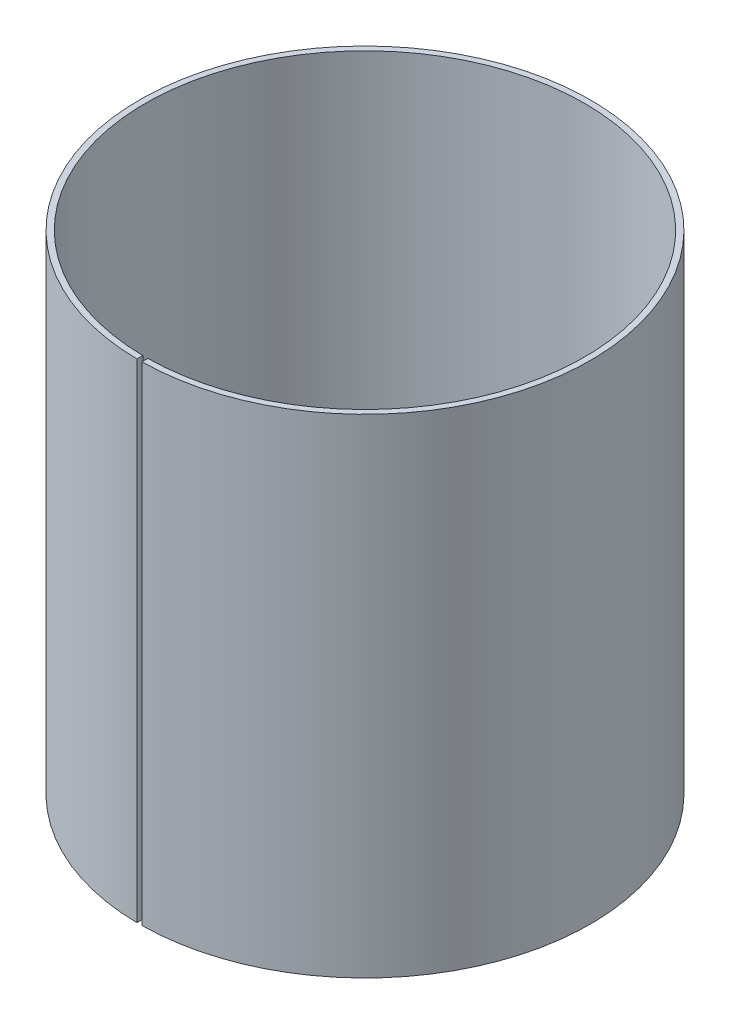
ISO-10303-21;
HEADER;
FILE_DESCRIPTION(('STEP AP214'),'2;1');
FILE_NAME('part.step','',(''),(''),'','','');
FILE_SCHEMA(('AUTOMOTIVE_DESIGN { 1 0 10303 214 1 1 1 1 }'));
ENDSEC;
DATA;
#1=APPLICATION_CONTEXT('core data for automotive mechanical design processes');
#2=APPLICATION_PROTOCOL_DEFINITION('international standard','automotive_design',2000,#1);
#3=PRODUCT_CONTEXT('',#1,'mechanical');
#4=PRODUCT('Part','Part','',(#3));
#5=PRODUCT_RELATED_PRODUCT_CATEGORY('part','',(#4));
#6=PRODUCT_DEFINITION_FORMATION('','',#4);
#7=PRODUCT_DEFINITION_CONTEXT('part definition',#1,'design');
#8=PRODUCT_DEFINITION('design','',#6,#7);
#9=PRODUCT_DEFINITION_SHAPE('','',#8);
#10=(LENGTH_UNIT() NAMED_UNIT(*) SI_UNIT(.MILLI.,.METRE.));
#11=(NAMED_UNIT(*) PLANE_ANGLE_UNIT() SI_UNIT($,.RADIAN.));
#12=(NAMED_UNIT(*) SI_UNIT($,.STERADIAN.) SOLID_ANGLE_UNIT());
#13=UNCERTAINTY_MEASURE_WITH_UNIT(LENGTH_MEASURE(1.E-05),#10,'distance_accuracy_value','');
#14=(GEOMETRIC_REPRESENTATION_CONTEXT(3) GLOBAL_UNCERTAINTY_ASSIGNED_CONTEXT((#13)) GLOBAL_UNIT_ASSIGNED_CONTEXT((#10,
#11,#12)) REPRESENTATION_CONTEXT('',''));
#15=CARTESIAN_POINT('',(0.,0.,0.));
#16=DIRECTION('',(0.,0.,1.));
#17=DIRECTION('',(1.,0.,0.));
#18=AXIS2_PLACEMENT_3D('',#15,#16,#17);
#19=CARTESIAN_POINT('',(0.,100.,0.));
#20=DIRECTION('',(0.,1.,0.));
#21=DIRECTION('',(0.,0.,1.));
#22=AXIS2_PLACEMENT_3D('',#19,#20,#21);
#23=PLANE('',#22);
#24=CARTESIAN_POINT('',(0.,100.,0.));
#25=DIRECTION('',(0.,1.,0.));
#26=DIRECTION('',(0.,0.,1.));
#27=AXIS2_PLACEMENT_3D('',#24,#25,#26);
#28=CIRCLE('',#27,45.);
#29=CARTESIAN_POINT('',(0.500000000000012,100.,44.9972221364831));
#30=VERTEX_POINT('',#29);
#31=CARTESIAN_POINT('',(-0.5,100.,44.9972221364831));
#32=VERTEX_POINT('',#31);
#33=EDGE_CURVE('E107',#30,#32,#28,.T.);
#34=ORIENTED_EDGE('',*,*,#33,.F.);
#35=DIRECTION('',(0.,0.,-1.));
#36=VECTOR('',#35,1.);
#37=CARTESIAN_POINT('',(0.500000000000012,100.,93.));
#38=LINE('',#37,#36);
#39=CARTESIAN_POINT('',(0.500000000000012,100.,46.1972942930644));
#40=VERTEX_POINT('',#39);
#41=EDGE_CURVE('E67',#40,#30,#38,.T.);
#42=ORIENTED_EDGE('',*,*,#41,.F.);
#43=CARTESIAN_POINT('',(0.,100.,0.));
#44=DIRECTION('',(0.,1.,0.));
#45=DIRECTION('',(0.,0.,1.));
#46=AXIS2_PLACEMENT_3D('',#43,#44,#45);
#47=CIRCLE('',#46,46.2);
#48=CARTESIAN_POINT('',(-0.5,100.,46.1972942930644));
#49=VERTEX_POINT('',#48);
#50=EDGE_CURVE('E106',#40,#49,#47,.T.);
#51=ORIENTED_EDGE('',*,*,#50,.T.);
#52=DIRECTION('',(0.,0.,-1.));
#53=VECTOR('',#52,1.);
#54=CARTESIAN_POINT('',(-0.5,100.,93.));
#55=LINE('',#54,#53);
#56=EDGE_CURVE('E85',#49,#32,#55,.T.);
#57=ORIENTED_EDGE('',*,*,#56,.T.);
#58=EDGE_LOOP('',(#34,#42,#51,#57));
#59=FACE_BOUND('',#58,.T.);
#60=ADVANCED_FACE('F43',(#59),#23,.T.);
#61=CARTESIAN_POINT('',(0.,0.,0.));
#62=DIRECTION('',(0.,1.,0.));
#63=DIRECTION('',(0.,0.,1.));
#64=AXIS2_PLACEMENT_3D('',#61,#62,#63);
#65=PLANE('',#64);
#66=DIRECTION('',(0.,0.,-1.));
#67=VECTOR('',#66,1.);
#68=CARTESIAN_POINT('',(0.500000000000014,0.,93.));
#69=LINE('',#68,#67);
#70=CARTESIAN_POINT('',(0.500000000000014,0.,46.1972942930644));
#71=VERTEX_POINT('',#70);
#72=CARTESIAN_POINT('',(0.500000000000014,0.,44.9972221364831));
#73=VERTEX_POINT('',#72);
#74=EDGE_CURVE('E92',#71,#73,#69,.T.);
#75=ORIENTED_EDGE('',*,*,#74,.T.);
#76=CARTESIAN_POINT('',(0.,0.,0.));
#77=DIRECTION('',(0.,1.,0.));
#78=DIRECTION('',(0.,0.,1.));
#79=AXIS2_PLACEMENT_3D('',#76,#77,#78);
#80=CIRCLE('',#79,45.);
#81=CARTESIAN_POINT('',(-0.500000000000001,0.,44.9972221364831));
#82=VERTEX_POINT('',#81);
#83=EDGE_CURVE('E101',#73,#82,#80,.T.);
#84=ORIENTED_EDGE('',*,*,#83,.T.);
#85=DIRECTION('',(0.,0.,-1.));
#86=VECTOR('',#85,1.);
#87=CARTESIAN_POINT('',(-0.499999999999988,0.,93.));
#88=LINE('',#87,#86);
#89=CARTESIAN_POINT('',(-0.499999999999988,0.,46.1972942930644));
#90=VERTEX_POINT('',#89);
#91=EDGE_CURVE('E59',#90,#82,#88,.T.);
#92=ORIENTED_EDGE('',*,*,#91,.F.);
#93=CARTESIAN_POINT('',(0.,0.,0.));
#94=DIRECTION('',(0.,1.,0.));
#95=DIRECTION('',(0.,0.,1.));
#96=AXIS2_PLACEMENT_3D('',#93,#94,#95);
#97=CIRCLE('',#96,46.2);
#98=EDGE_CURVE('E99',#71,#90,#97,.T.);
#99=ORIENTED_EDGE('',*,*,#98,.F.);
#100=EDGE_LOOP('',(#75,#84,#92,#99));
#101=FACE_BOUND('',#100,.T.);
#102=ADVANCED_FACE('F98',(#101),#65,.F.);
#103=CARTESIAN_POINT('',(0.,100.,0.));
#104=DIRECTION('',(0.,-1.,0.));
#105=DIRECTION('',(0.,0.,-1.));
#106=AXIS2_PLACEMENT_3D('',#103,#104,#105);
#107=CYLINDRICAL_SURFACE('',#106,46.2);
#108=DIRECTION('',(0.,-1.,0.));
#109=VECTOR('',#108,1.);
#110=CARTESIAN_POINT('',(0.500000000000012,100.,46.1972942930644));
#111=LINE('',#110,#109);
#112=EDGE_CURVE('E91',#71,#40,#111,.F.);
#113=ORIENTED_EDGE('',*,*,#112,.F.);
#114=ORIENTED_EDGE('',*,*,#98,.T.);
#115=DIRECTION('',(0.,-1.,0.));
#116=VECTOR('',#115,1.);
#117=CARTESIAN_POINT('',(-0.5,100.,46.1972942930644));
#118=LINE('',#117,#116);
#119=EDGE_CURVE('E82',#49,#90,#118,.T.);
#120=ORIENTED_EDGE('',*,*,#119,.F.);
#121=ORIENTED_EDGE('',*,*,#50,.F.);
#122=EDGE_LOOP('',(#113,#114,#120,#121));
#123=FACE_BOUND('',#122,.T.);
#124=ADVANCED_FACE('F45',(#123),#107,.T.);
#125=CARTESIAN_POINT('',(0.,100.,0.));
#126=DIRECTION('',(0.,-1.,0.));
#127=DIRECTION('',(0.,0.,-1.));
#128=AXIS2_PLACEMENT_3D('',#125,#126,#127);
#129=CYLINDRICAL_SURFACE('',#128,45.);
#130=ORIENTED_EDGE('',*,*,#83,.F.);
#131=DIRECTION('',(0.,-1.,0.));
#132=VECTOR('',#131,1.);
#133=CARTESIAN_POINT('',(0.500000000000012,100.,44.9972221364831));
#134=LINE('',#133,#132);
#135=EDGE_CURVE('E11',#73,#30,#134,.F.);
#136=ORIENTED_EDGE('',*,*,#135,.T.);
#137=ORIENTED_EDGE('',*,*,#33,.T.);
#138=DIRECTION('',(0.,-1.,0.));
#139=VECTOR('',#138,1.);
#140=CARTESIAN_POINT('',(-0.5,100.,44.9972221364831));
#141=LINE('',#140,#139);
#142=EDGE_CURVE('E52',#32,#82,#141,.T.);
#143=ORIENTED_EDGE('',*,*,#142,.T.);
#144=EDGE_LOOP('',(#130,#136,#137,#143));
#145=FACE_BOUND('',#144,.T.);
#146=ADVANCED_FACE('F117',(#145),#129,.F.);
#147=CARTESIAN_POINT('',(-0.5,100.,93.));
#148=DIRECTION('',(1.,0.,0.));
#149=DIRECTION('',(0.,1.,0.));
#150=AXIS2_PLACEMENT_3D('',#147,#148,#149);
#151=PLANE('',#150);
#152=ORIENTED_EDGE('',*,*,#119,.T.);
#153=ORIENTED_EDGE('',*,*,#91,.T.);
#154=ORIENTED_EDGE('',*,*,#142,.F.);
#155=ORIENTED_EDGE('',*,*,#56,.F.);
#156=EDGE_LOOP('',(#152,#153,#154,#155));
#157=FACE_BOUND('',#156,.T.);
#158=ADVANCED_FACE('F83',(#157),#151,.T.);
#159=CARTESIAN_POINT('',(0.500000000000014,0.,93.));
#160=DIRECTION('',(-1.,0.,0.));
#161=DIRECTION('',(0.,-1.,0.));
#162=AXIS2_PLACEMENT_3D('',#159,#160,#161);
#163=PLANE('',#162);
#164=ORIENTED_EDGE('',*,*,#112,.T.);
#165=ORIENTED_EDGE('',*,*,#41,.T.);
#166=ORIENTED_EDGE('',*,*,#135,.F.);
#167=ORIENTED_EDGE('',*,*,#74,.F.);
#168=EDGE_LOOP('',(#164,#165,#166,#167));
#169=FACE_BOUND('',#168,.T.);
#170=ADVANCED_FACE('F129',(#169),#163,.T.);
#171=CLOSED_SHELL('',(#60,#102,#124,#146,#158,#170));
#172=MANIFOLD_SOLID_BREP('B2',#171);
#173=ADVANCED_BREP_SHAPE_REPRESENTATION('',(#18,#172),#14);
#174=SHAPE_DEFINITION_REPRESENTATION(#9,#173);
ENDSEC;
END-ISO-10303-21;
